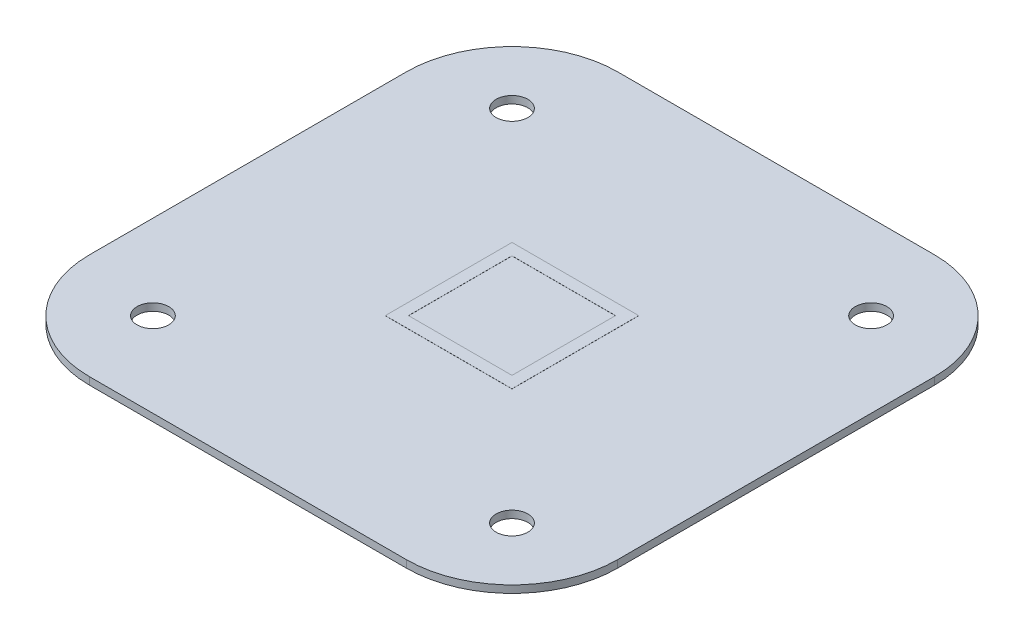
ISO-10303-21;
HEADER;
FILE_DESCRIPTION(('STEP AP214'),'2;1');
FILE_NAME('part.step','',(''),(''),'','','');
FILE_SCHEMA(('AUTOMOTIVE_DESIGN { 1 0 10303 214 1 1 1 1 }'));
ENDSEC;
DATA;
#1=APPLICATION_CONTEXT('core data for automotive mechanical design processes');
#2=APPLICATION_PROTOCOL_DEFINITION('international standard','automotive_design',2000,#1);
#3=PRODUCT_CONTEXT('',#1,'mechanical');
#4=PRODUCT('Part','Part','',(#3));
#5=PRODUCT_RELATED_PRODUCT_CATEGORY('part','',(#4));
#6=PRODUCT_DEFINITION_FORMATION('','',#4);
#7=PRODUCT_DEFINITION_CONTEXT('part definition',#1,'design');
#8=PRODUCT_DEFINITION('design','',#6,#7);
#9=PRODUCT_DEFINITION_SHAPE('','',#8);
#10=(LENGTH_UNIT() NAMED_UNIT(*) SI_UNIT(.MILLI.,.METRE.));
#11=(NAMED_UNIT(*) PLANE_ANGLE_UNIT() SI_UNIT($,.RADIAN.));
#12=(NAMED_UNIT(*) SI_UNIT($,.STERADIAN.) SOLID_ANGLE_UNIT());
#13=UNCERTAINTY_MEASURE_WITH_UNIT(LENGTH_MEASURE(1.E-05),#10,'distance_accuracy_value','');
#14=(GEOMETRIC_REPRESENTATION_CONTEXT(3) GLOBAL_UNCERTAINTY_ASSIGNED_CONTEXT((#13)) GLOBAL_UNIT_ASSIGNED_CONTEXT((#10,
#11,#12)) REPRESENTATION_CONTEXT('',''));
#15=CARTESIAN_POINT('',(0.,0.,0.));
#16=DIRECTION('',(0.,0.,1.));
#17=DIRECTION('',(1.,0.,0.));
#18=AXIS2_PLACEMENT_3D('',#15,#16,#17);
#19=CARTESIAN_POINT('',(0.,0.7,0.));
#20=DIRECTION('',(0.,1.,0.));
#21=DIRECTION('',(0.,0.,1.));
#22=AXIS2_PLACEMENT_3D('',#19,#20,#21);
#23=PLANE('',#22);
#24=CARTESIAN_POINT('',(-17.,0.7,17.));
#25=DIRECTION('',(0.,1.,0.));
#26=DIRECTION('',(0.,0.,1.));
#27=AXIS2_PLACEMENT_3D('',#24,#25,#26);
#28=CIRCLE('',#27,1.5);
#29=CARTESIAN_POINT('',(-17.,0.7,18.5));
#30=VERTEX_POINT('',#29);
#31=EDGE_CURVE('E213',#30,#30,#28,.T.);
#32=ORIENTED_EDGE('',*,*,#31,.F.);
#33=EDGE_LOOP('',(#32));
#34=FACE_BOUND('',#33,.T.);
#35=CARTESIAN_POINT('',(17.,0.7,-17.));
#36=DIRECTION('',(0.,1.,0.));
#37=DIRECTION('',(0.,0.,1.));
#38=AXIS2_PLACEMENT_3D('',#35,#36,#37);
#39=CIRCLE('',#38,1.5);
#40=CARTESIAN_POINT('',(17.,0.7,-15.5));
#41=VERTEX_POINT('',#40);
#42=EDGE_CURVE('E225',#41,#41,#39,.T.);
#43=ORIENTED_EDGE('',*,*,#42,.F.);
#44=EDGE_LOOP('',(#43));
#45=FACE_BOUND('',#44,.T.);
#46=DIRECTION('',(-1.,0.,0.));
#47=VECTOR('',#46,1.);
#48=CARTESIAN_POINT('',(25.,0.7,-25.));
#49=LINE('',#48,#47);
#50=CARTESIAN_POINT('',(15.,0.7,-25.));
#51=VERTEX_POINT('',#50);
#52=CARTESIAN_POINT('',(-15.,0.7,-25.));
#53=VERTEX_POINT('',#52);
#54=EDGE_CURVE('E247',#51,#53,#49,.T.);
#55=ORIENTED_EDGE('',*,*,#54,.T.);
#56=CARTESIAN_POINT('',(-15.,0.7,-15.));
#57=DIRECTION('',(0.,1.,0.));
#58=DIRECTION('',(0.,0.,1.));
#59=AXIS2_PLACEMENT_3D('',#56,#57,#58);
#60=CIRCLE('',#59,10.);
#61=CARTESIAN_POINT('',(-25.,0.7,-15.));
#62=VERTEX_POINT('',#61);
#63=EDGE_CURVE('E284',#53,#62,#60,.T.);
#64=ORIENTED_EDGE('',*,*,#63,.T.);
#65=DIRECTION('',(0.,0.,1.));
#66=VECTOR('',#65,1.);
#67=CARTESIAN_POINT('',(-25.,0.7,25.));
#68=LINE('',#67,#66);
#69=CARTESIAN_POINT('',(-25.,0.7,15.));
#70=VERTEX_POINT('',#69);
#71=EDGE_CURVE('E237',#62,#70,#68,.T.);
#72=ORIENTED_EDGE('',*,*,#71,.T.);
#73=CARTESIAN_POINT('',(-15.,0.7,15.));
#74=DIRECTION('',(0.,1.,0.));
#75=DIRECTION('',(0.,0.,1.));
#76=AXIS2_PLACEMENT_3D('',#73,#74,#75);
#77=CIRCLE('',#76,10.);
#78=CARTESIAN_POINT('',(-15.,0.7,25.));
#79=VERTEX_POINT('',#78);
#80=EDGE_CURVE('E278',#70,#79,#77,.T.);
#81=ORIENTED_EDGE('',*,*,#80,.T.);
#82=DIRECTION('',(1.,0.,0.));
#83=VECTOR('',#82,1.);
#84=CARTESIAN_POINT('',(25.,0.7,25.));
#85=LINE('',#84,#83);
#86=CARTESIAN_POINT('',(15.,0.7,25.));
#87=VERTEX_POINT('',#86);
#88=EDGE_CURVE('E240',#79,#87,#85,.T.);
#89=ORIENTED_EDGE('',*,*,#88,.T.);
#90=CARTESIAN_POINT('',(15.,0.7,15.));
#91=DIRECTION('',(0.,1.,0.));
#92=DIRECTION('',(0.,0.,1.));
#93=AXIS2_PLACEMENT_3D('',#90,#91,#92);
#94=CIRCLE('',#93,10.);
#95=CARTESIAN_POINT('',(25.,0.7,15.));
#96=VERTEX_POINT('',#95);
#97=EDGE_CURVE('E280',#87,#96,#94,.T.);
#98=ORIENTED_EDGE('',*,*,#97,.T.);
#99=DIRECTION('',(0.,0.,-1.));
#100=VECTOR('',#99,1.);
#101=CARTESIAN_POINT('',(25.,0.7,25.));
#102=LINE('',#101,#100);
#103=CARTESIAN_POINT('',(25.,0.7,-15.));
#104=VERTEX_POINT('',#103);
#105=EDGE_CURVE('E244',#96,#104,#102,.T.);
#106=ORIENTED_EDGE('',*,*,#105,.T.);
#107=CARTESIAN_POINT('',(15.,0.7,-15.));
#108=DIRECTION('',(0.,1.,0.));
#109=DIRECTION('',(0.,0.,1.));
#110=AXIS2_PLACEMENT_3D('',#107,#108,#109);
#111=CIRCLE('',#110,10.);
#112=EDGE_CURVE('E282',#104,#51,#111,.T.);
#113=ORIENTED_EDGE('',*,*,#112,.T.);
#114=EDGE_LOOP('',(#55,#64,#72,#81,#89,#98,#106,#113));
#115=FACE_BOUND('',#114,.T.);
#116=CARTESIAN_POINT('',(-17.,0.7,-17.));
#117=DIRECTION('',(0.,1.,0.));
#118=DIRECTION('',(0.,0.,1.));
#119=AXIS2_PLACEMENT_3D('',#116,#117,#118);
#120=CIRCLE('',#119,1.5);
#121=CARTESIAN_POINT('',(-17.,0.7,-15.5));
#122=VERTEX_POINT('',#121);
#123=EDGE_CURVE('E231',#122,#122,#120,.T.);
#124=ORIENTED_EDGE('',*,*,#123,.F.);
#125=EDGE_LOOP('',(#124));
#126=FACE_BOUND('',#125,.T.);
#127=CARTESIAN_POINT('',(17.,0.7,17.));
#128=DIRECTION('',(0.,1.,0.));
#129=DIRECTION('',(0.,0.,1.));
#130=AXIS2_PLACEMENT_3D('',#127,#128,#129);
#131=CIRCLE('',#130,1.5);
#132=CARTESIAN_POINT('',(17.,0.7,18.5));
#133=VERTEX_POINT('',#132);
#134=EDGE_CURVE('E219',#133,#133,#131,.T.);
#135=ORIENTED_EDGE('',*,*,#134,.F.);
#136=EDGE_LOOP('',(#135));
#137=FACE_BOUND('',#136,.T.);
#138=DIRECTION('',(1.,0.,0.));
#139=VECTOR('',#138,1.);
#140=CARTESIAN_POINT('',(6.,0.7,6.));
#141=LINE('',#140,#139);
#142=CARTESIAN_POINT('',(-6.,0.7,6.));
#143=VERTEX_POINT('',#142);
#144=CARTESIAN_POINT('',(6.,0.7,6.));
#145=VERTEX_POINT('',#144);
#146=EDGE_CURVE('E199',#143,#145,#141,.T.);
#147=ORIENTED_EDGE('',*,*,#146,.F.);
#148=DIRECTION('',(0.,0.,1.));
#149=VECTOR('',#148,1.);
#150=CARTESIAN_POINT('',(-6.,0.7,6.));
#151=LINE('',#150,#149);
#152=CARTESIAN_POINT('',(-6.,0.7,-6.));
#153=VERTEX_POINT('',#152);
#154=EDGE_CURVE('E164',#153,#143,#151,.T.);
#155=ORIENTED_EDGE('',*,*,#154,.F.);
#156=DIRECTION('',(-1.,0.,0.));
#157=VECTOR('',#156,1.);
#158=CARTESIAN_POINT('',(6.,0.7,-6.));
#159=LINE('',#158,#157);
#160=CARTESIAN_POINT('',(6.,0.7,-6.));
#161=VERTEX_POINT('',#160);
#162=EDGE_CURVE('E190',#161,#153,#159,.T.);
#163=ORIENTED_EDGE('',*,*,#162,.F.);
#164=DIRECTION('',(0.,0.,-1.));
#165=VECTOR('',#164,1.);
#166=CARTESIAN_POINT('',(6.,0.7,6.));
#167=LINE('',#166,#165);
#168=EDGE_CURVE('E201',#145,#161,#167,.T.);
#169=ORIENTED_EDGE('',*,*,#168,.F.);
#170=EDGE_LOOP('',(#147,#155,#163,#169));
#171=FACE_BOUND('',#170,.T.);
#172=ADVANCED_FACE('F33',(#34,#45,#115,#126,#137,#171),#23,.T.);
#173=CARTESIAN_POINT('',(0.,0.,0.));
#174=DIRECTION('',(0.,1.,0.));
#175=DIRECTION('',(0.,0.,1.));
#176=AXIS2_PLACEMENT_3D('',#173,#174,#175);
#177=PLANE('',#176);
#178=DIRECTION('',(0.,0.,1.));
#179=VECTOR('',#178,1.);
#180=CARTESIAN_POINT('',(-25.,0.,25.));
#181=LINE('',#180,#179);
#182=CARTESIAN_POINT('',(-25.,0.,-15.));
#183=VERTEX_POINT('',#182);
#184=CARTESIAN_POINT('',(-25.,0.,15.));
#185=VERTEX_POINT('',#184);
#186=EDGE_CURVE('E234',#183,#185,#181,.T.);
#187=ORIENTED_EDGE('',*,*,#186,.F.);
#188=CARTESIAN_POINT('',(-15.,0.,-15.));
#189=DIRECTION('',(0.,1.,0.));
#190=DIRECTION('',(0.,0.,1.));
#191=AXIS2_PLACEMENT_3D('',#188,#189,#190);
#192=CIRCLE('',#191,10.);
#193=CARTESIAN_POINT('',(-15.,0.,-25.));
#194=VERTEX_POINT('',#193);
#195=EDGE_CURVE('E271',#183,#194,#192,.F.);
#196=ORIENTED_EDGE('',*,*,#195,.T.);
#197=DIRECTION('',(-1.,0.,0.));
#198=VECTOR('',#197,1.);
#199=CARTESIAN_POINT('',(25.,0.,-25.));
#200=LINE('',#199,#198);
#201=CARTESIAN_POINT('',(15.,0.,-25.));
#202=VERTEX_POINT('',#201);
#203=EDGE_CURVE('E241',#202,#194,#200,.T.);
#204=ORIENTED_EDGE('',*,*,#203,.F.);
#205=CARTESIAN_POINT('',(15.,0.,-15.));
#206=DIRECTION('',(0.,1.,0.));
#207=DIRECTION('',(0.,0.,1.));
#208=AXIS2_PLACEMENT_3D('',#205,#206,#207);
#209=CIRCLE('',#208,10.);
#210=CARTESIAN_POINT('',(25.,0.,-15.));
#211=VERTEX_POINT('',#210);
#212=EDGE_CURVE('E269',#202,#211,#209,.F.);
#213=ORIENTED_EDGE('',*,*,#212,.T.);
#214=DIRECTION('',(0.,0.,-1.));
#215=VECTOR('',#214,1.);
#216=CARTESIAN_POINT('',(25.,0.,25.));
#217=LINE('',#216,#215);
#218=CARTESIAN_POINT('',(25.,0.,15.));
#219=VERTEX_POINT('',#218);
#220=EDGE_CURVE('E256',#219,#211,#217,.T.);
#221=ORIENTED_EDGE('',*,*,#220,.F.);
#222=CARTESIAN_POINT('',(15.,0.,15.));
#223=DIRECTION('',(0.,1.,0.));
#224=DIRECTION('',(0.,0.,1.));
#225=AXIS2_PLACEMENT_3D('',#222,#223,#224);
#226=CIRCLE('',#225,10.);
#227=CARTESIAN_POINT('',(15.,0.,25.));
#228=VERTEX_POINT('',#227);
#229=EDGE_CURVE('E267',#219,#228,#226,.F.);
#230=ORIENTED_EDGE('',*,*,#229,.T.);
#231=DIRECTION('',(1.,0.,0.));
#232=VECTOR('',#231,1.);
#233=CARTESIAN_POINT('',(25.,0.,25.));
#234=LINE('',#233,#232);
#235=CARTESIAN_POINT('',(-15.,0.,25.));
#236=VERTEX_POINT('',#235);
#237=EDGE_CURVE('E253',#236,#228,#234,.T.);
#238=ORIENTED_EDGE('',*,*,#237,.F.);
#239=CARTESIAN_POINT('',(-15.,0.,15.));
#240=DIRECTION('',(0.,1.,0.));
#241=DIRECTION('',(0.,0.,1.));
#242=AXIS2_PLACEMENT_3D('',#239,#240,#241);
#243=CIRCLE('',#242,10.);
#244=EDGE_CURVE('E265',#236,#185,#243,.F.);
#245=ORIENTED_EDGE('',*,*,#244,.T.);
#246=EDGE_LOOP('',(#187,#196,#204,#213,#221,#230,#238,#245));
#247=FACE_BOUND('',#246,.T.);
#248=CARTESIAN_POINT('',(-17.,0.,-17.));
#249=DIRECTION('',(0.,1.,0.));
#250=DIRECTION('',(0.,0.,1.));
#251=AXIS2_PLACEMENT_3D('',#248,#249,#250);
#252=CIRCLE('',#251,1.5);
#253=CARTESIAN_POINT('',(-17.,0.,-15.5));
#254=VERTEX_POINT('',#253);
#255=EDGE_CURVE('E228',#254,#254,#252,.T.);
#256=ORIENTED_EDGE('',*,*,#255,.T.);
#257=EDGE_LOOP('',(#256));
#258=FACE_BOUND('',#257,.T.);
#259=CARTESIAN_POINT('',(17.,0.,-17.));
#260=DIRECTION('',(0.,1.,0.));
#261=DIRECTION('',(0.,0.,1.));
#262=AXIS2_PLACEMENT_3D('',#259,#260,#261);
#263=CIRCLE('',#262,1.5);
#264=CARTESIAN_POINT('',(17.,0.,-15.5));
#265=VERTEX_POINT('',#264);
#266=EDGE_CURVE('E222',#265,#265,#263,.T.);
#267=ORIENTED_EDGE('',*,*,#266,.T.);
#268=EDGE_LOOP('',(#267));
#269=FACE_BOUND('',#268,.T.);
#270=CARTESIAN_POINT('',(17.,0.,17.));
#271=DIRECTION('',(0.,1.,0.));
#272=DIRECTION('',(0.,0.,1.));
#273=AXIS2_PLACEMENT_3D('',#270,#271,#272);
#274=CIRCLE('',#273,1.5);
#275=CARTESIAN_POINT('',(17.,0.,18.5));
#276=VERTEX_POINT('',#275);
#277=EDGE_CURVE('E216',#276,#276,#274,.T.);
#278=ORIENTED_EDGE('',*,*,#277,.T.);
#279=EDGE_LOOP('',(#278));
#280=FACE_BOUND('',#279,.T.);
#281=CARTESIAN_POINT('',(-17.,0.,17.));
#282=DIRECTION('',(0.,1.,0.));
#283=DIRECTION('',(0.,0.,1.));
#284=AXIS2_PLACEMENT_3D('',#281,#282,#283);
#285=CIRCLE('',#284,1.5);
#286=CARTESIAN_POINT('',(-17.,0.,18.5));
#287=VERTEX_POINT('',#286);
#288=EDGE_CURVE('E212',#287,#287,#285,.T.);
#289=ORIENTED_EDGE('',*,*,#288,.T.);
#290=EDGE_LOOP('',(#289));
#291=FACE_BOUND('',#290,.T.);
#292=ADVANCED_FACE('F301',(#247,#258,#269,#280,#291),#177,.F.);
#293=CARTESIAN_POINT('',(-25.,0.7,25.));
#294=DIRECTION('',(1.,0.,0.));
#295=DIRECTION('',(0.,0.,-1.));
#296=AXIS2_PLACEMENT_3D('',#293,#294,#295);
#297=PLANE('',#296);
#298=ORIENTED_EDGE('',*,*,#71,.F.);
#299=DIRECTION('',(0.,-1.,0.));
#300=VECTOR('',#299,1.);
#301=CARTESIAN_POINT('',(-25.,0.7,-15.));
#302=LINE('',#301,#300);
#303=EDGE_CURVE('E262',#62,#183,#302,.T.);
#304=ORIENTED_EDGE('',*,*,#303,.T.);
#305=ORIENTED_EDGE('',*,*,#186,.T.);
#306=DIRECTION('',(0.,-1.,0.));
#307=VECTOR('',#306,1.);
#308=CARTESIAN_POINT('',(-25.,0.7,15.));
#309=LINE('',#308,#307);
#310=EDGE_CURVE('E250',#185,#70,#309,.F.);
#311=ORIENTED_EDGE('',*,*,#310,.T.);
#312=EDGE_LOOP('',(#298,#304,#305,#311));
#313=FACE_BOUND('',#312,.T.);
#314=ADVANCED_FACE('F329',(#313),#297,.F.);
#315=CARTESIAN_POINT('',(25.,0.7,25.));
#316=DIRECTION('',(0.,0.,-1.));
#317=DIRECTION('',(-1.,0.,0.));
#318=AXIS2_PLACEMENT_3D('',#315,#316,#317);
#319=PLANE('',#318);
#320=ORIENTED_EDGE('',*,*,#237,.T.);
#321=DIRECTION('',(0.,-1.,0.));
#322=VECTOR('',#321,1.);
#323=CARTESIAN_POINT('',(15.,0.7,25.));
#324=LINE('',#323,#322);
#325=EDGE_CURVE('E11',#228,#87,#324,.F.);
#326=ORIENTED_EDGE('',*,*,#325,.T.);
#327=ORIENTED_EDGE('',*,*,#88,.F.);
#328=DIRECTION('',(0.,-1.,0.));
#329=VECTOR('',#328,1.);
#330=CARTESIAN_POINT('',(-15.,0.7,25.));
#331=LINE('',#330,#329);
#332=EDGE_CURVE('E41',#79,#236,#331,.T.);
#333=ORIENTED_EDGE('',*,*,#332,.T.);
#334=EDGE_LOOP('',(#320,#326,#327,#333));
#335=FACE_BOUND('',#334,.T.);
#336=ADVANCED_FACE('F295',(#335),#319,.F.);
#337=CARTESIAN_POINT('',(25.,0.7,25.));
#338=DIRECTION('',(-1.,0.,0.));
#339=DIRECTION('',(0.,0.,1.));
#340=AXIS2_PLACEMENT_3D('',#337,#338,#339);
#341=PLANE('',#340);
#342=ORIENTED_EDGE('',*,*,#220,.T.);
#343=DIRECTION('',(0.,-1.,0.));
#344=VECTOR('',#343,1.);
#345=CARTESIAN_POINT('',(25.,0.7,-15.));
#346=LINE('',#345,#344);
#347=EDGE_CURVE('E289',#211,#104,#346,.F.);
#348=ORIENTED_EDGE('',*,*,#347,.T.);
#349=ORIENTED_EDGE('',*,*,#105,.F.);
#350=DIRECTION('',(0.,-1.,0.));
#351=VECTOR('',#350,1.);
#352=CARTESIAN_POINT('',(25.,0.7,15.));
#353=LINE('',#352,#351);
#354=EDGE_CURVE('E286',#96,#219,#353,.T.);
#355=ORIENTED_EDGE('',*,*,#354,.T.);
#356=EDGE_LOOP('',(#342,#348,#349,#355));
#357=FACE_BOUND('',#356,.T.);
#358=ADVANCED_FACE('F310',(#357),#341,.F.);
#359=CARTESIAN_POINT('',(25.,0.7,-25.));
#360=DIRECTION('',(0.,0.,1.));
#361=DIRECTION('',(1.,0.,0.));
#362=AXIS2_PLACEMENT_3D('',#359,#360,#361);
#363=PLANE('',#362);
#364=ORIENTED_EDGE('',*,*,#203,.T.);
#365=DIRECTION('',(0.,-1.,0.));
#366=VECTOR('',#365,1.);
#367=CARTESIAN_POINT('',(-15.,0.7,-25.));
#368=LINE('',#367,#366);
#369=EDGE_CURVE('E276',#194,#53,#368,.F.);
#370=ORIENTED_EDGE('',*,*,#369,.T.);
#371=ORIENTED_EDGE('',*,*,#54,.F.);
#372=DIRECTION('',(0.,-1.,0.));
#373=VECTOR('',#372,1.);
#374=CARTESIAN_POINT('',(15.,0.7,-25.));
#375=LINE('',#374,#373);
#376=EDGE_CURVE('E273',#51,#202,#375,.T.);
#377=ORIENTED_EDGE('',*,*,#376,.T.);
#378=EDGE_LOOP('',(#364,#370,#371,#377));
#379=FACE_BOUND('',#378,.T.);
#380=ADVANCED_FACE('F321',(#379),#363,.F.);
#381=CARTESIAN_POINT('',(-17.,0.7,-17.));
#382=DIRECTION('',(0.,-1.,0.));
#383=DIRECTION('',(0.,0.,-1.));
#384=AXIS2_PLACEMENT_3D('',#381,#382,#383);
#385=CYLINDRICAL_SURFACE('',#384,1.5);
#386=ORIENTED_EDGE('',*,*,#123,.T.);
#387=EDGE_LOOP('',(#386));
#388=FACE_BOUND('',#387,.T.);
#389=ORIENTED_EDGE('',*,*,#255,.F.);
#390=EDGE_LOOP('',(#389));
#391=FACE_BOUND('',#390,.T.);
#392=ADVANCED_FACE('F393',(#388,#391),#385,.F.);
#393=CARTESIAN_POINT('',(17.,0.7,-17.));
#394=DIRECTION('',(0.,-1.,0.));
#395=DIRECTION('',(0.,0.,-1.));
#396=AXIS2_PLACEMENT_3D('',#393,#394,#395);
#397=CYLINDRICAL_SURFACE('',#396,1.5);
#398=ORIENTED_EDGE('',*,*,#42,.T.);
#399=EDGE_LOOP('',(#398));
#400=FACE_BOUND('',#399,.T.);
#401=ORIENTED_EDGE('',*,*,#266,.F.);
#402=EDGE_LOOP('',(#401));
#403=FACE_BOUND('',#402,.T.);
#404=ADVANCED_FACE('F390',(#400,#403),#397,.F.);
#405=CARTESIAN_POINT('',(17.,0.7,17.));
#406=DIRECTION('',(0.,-1.,0.));
#407=DIRECTION('',(0.,0.,-1.));
#408=AXIS2_PLACEMENT_3D('',#405,#406,#407);
#409=CYLINDRICAL_SURFACE('',#408,1.5);
#410=ORIENTED_EDGE('',*,*,#134,.T.);
#411=EDGE_LOOP('',(#410));
#412=FACE_BOUND('',#411,.T.);
#413=ORIENTED_EDGE('',*,*,#277,.F.);
#414=EDGE_LOOP('',(#413));
#415=FACE_BOUND('',#414,.T.);
#416=ADVANCED_FACE('F386',(#412,#415),#409,.F.);
#417=CARTESIAN_POINT('',(-17.,0.7,17.));
#418=DIRECTION('',(0.,-1.,0.));
#419=DIRECTION('',(0.,0.,-1.));
#420=AXIS2_PLACEMENT_3D('',#417,#418,#419);
#421=CYLINDRICAL_SURFACE('',#420,1.5);
#422=ORIENTED_EDGE('',*,*,#31,.T.);
#423=EDGE_LOOP('',(#422));
#424=FACE_BOUND('',#423,.T.);
#425=ORIENTED_EDGE('',*,*,#288,.F.);
#426=EDGE_LOOP('',(#425));
#427=FACE_BOUND('',#426,.T.);
#428=ADVANCED_FACE('F383',(#424,#427),#421,.F.);
#429=CARTESIAN_POINT('',(-15.,0.7,-15.));
#430=DIRECTION('',(0.,-1.,0.));
#431=DIRECTION('',(0.,0.,-1.));
#432=AXIS2_PLACEMENT_3D('',#429,#430,#431);
#433=CYLINDRICAL_SURFACE('',#432,10.);
#434=ORIENTED_EDGE('',*,*,#63,.F.);
#435=ORIENTED_EDGE('',*,*,#369,.F.);
#436=ORIENTED_EDGE('',*,*,#195,.F.);
#437=ORIENTED_EDGE('',*,*,#303,.F.);
#438=EDGE_LOOP('',(#434,#435,#436,#437));
#439=FACE_BOUND('',#438,.T.);
#440=ADVANCED_FACE('F326',(#439),#433,.T.);
#441=CARTESIAN_POINT('',(15.,0.7,-15.));
#442=DIRECTION('',(0.,-1.,0.));
#443=DIRECTION('',(0.,0.,-1.));
#444=AXIS2_PLACEMENT_3D('',#441,#442,#443);
#445=CYLINDRICAL_SURFACE('',#444,10.);
#446=ORIENTED_EDGE('',*,*,#112,.F.);
#447=ORIENTED_EDGE('',*,*,#347,.F.);
#448=ORIENTED_EDGE('',*,*,#212,.F.);
#449=ORIENTED_EDGE('',*,*,#376,.F.);
#450=EDGE_LOOP('',(#446,#447,#448,#449));
#451=FACE_BOUND('',#450,.T.);
#452=ADVANCED_FACE('F318',(#451),#445,.T.);
#453=CARTESIAN_POINT('',(15.,0.7,15.));
#454=DIRECTION('',(0.,-1.,0.));
#455=DIRECTION('',(0.,0.,-1.));
#456=AXIS2_PLACEMENT_3D('',#453,#454,#455);
#457=CYLINDRICAL_SURFACE('',#456,10.);
#458=ORIENTED_EDGE('',*,*,#97,.F.);
#459=ORIENTED_EDGE('',*,*,#325,.F.);
#460=ORIENTED_EDGE('',*,*,#229,.F.);
#461=ORIENTED_EDGE('',*,*,#354,.F.);
#462=EDGE_LOOP('',(#458,#459,#460,#461));
#463=FACE_BOUND('',#462,.T.);
#464=ADVANCED_FACE('F307',(#463),#457,.T.);
#465=CARTESIAN_POINT('',(-15.,0.7,15.));
#466=DIRECTION('',(0.,-1.,0.));
#467=DIRECTION('',(0.,0.,-1.));
#468=AXIS2_PLACEMENT_3D('',#465,#466,#467);
#469=CYLINDRICAL_SURFACE('',#468,10.);
#470=ORIENTED_EDGE('',*,*,#80,.F.);
#471=ORIENTED_EDGE('',*,*,#310,.F.);
#472=ORIENTED_EDGE('',*,*,#244,.F.);
#473=ORIENTED_EDGE('',*,*,#332,.F.);
#474=EDGE_LOOP('',(#470,#471,#472,#473));
#475=FACE_BOUND('',#474,.T.);
#476=ADVANCED_FACE('F35',(#475),#469,.T.);
#477=CARTESIAN_POINT('',(0.,0.71,0.));
#478=DIRECTION('',(0.,1.,0.));
#479=DIRECTION('',(0.,0.,1.));
#480=AXIS2_PLACEMENT_3D('',#477,#478,#479);
#481=PLANE('',#480);
#482=DIRECTION('',(0.,0.,1.));
#483=VECTOR('',#482,1.);
#484=CARTESIAN_POINT('',(-6.,0.71,6.));
#485=LINE('',#484,#483);
#486=CARTESIAN_POINT('',(-6.,0.71,-6.));
#487=VERTEX_POINT('',#486);
#488=CARTESIAN_POINT('',(-6.,0.71,6.));
#489=VERTEX_POINT('',#488);
#490=EDGE_CURVE('E186',#487,#489,#485,.T.);
#491=ORIENTED_EDGE('',*,*,#490,.T.);
#492=DIRECTION('',(1.,0.,0.));
#493=VECTOR('',#492,1.);
#494=CARTESIAN_POINT('',(6.,0.71,6.));
#495=LINE('',#494,#493);
#496=CARTESIAN_POINT('',(6.,0.71,6.));
#497=VERTEX_POINT('',#496);
#498=EDGE_CURVE('E189',#489,#497,#495,.T.);
#499=ORIENTED_EDGE('',*,*,#498,.T.);
#500=DIRECTION('',(0.,0.,-1.));
#501=VECTOR('',#500,1.);
#502=CARTESIAN_POINT('',(6.,0.71,6.));
#503=LINE('',#502,#501);
#504=CARTESIAN_POINT('',(6.,0.71,-6.));
#505=VERTEX_POINT('',#504);
#506=EDGE_CURVE('E192',#497,#505,#503,.T.);
#507=ORIENTED_EDGE('',*,*,#506,.T.);
#508=DIRECTION('',(-1.,0.,0.));
#509=VECTOR('',#508,1.);
#510=CARTESIAN_POINT('',(6.,0.71,-6.));
#511=LINE('',#510,#509);
#512=EDGE_CURVE('E194',#505,#487,#511,.T.);
#513=ORIENTED_EDGE('',*,*,#512,.T.);
#514=EDGE_LOOP('',(#491,#499,#507,#513));
#515=FACE_BOUND('',#514,.T.);
#516=DIRECTION('',(1.,0.,0.));
#517=VECTOR('',#516,1.);
#518=CARTESIAN_POINT('',(4.9,0.71,4.9));
#519=LINE('',#518,#517);
#520=CARTESIAN_POINT('',(-4.9,0.71,4.9));
#521=VERTEX_POINT('',#520);
#522=CARTESIAN_POINT('',(4.9,0.71,4.9));
#523=VERTEX_POINT('',#522);
#524=EDGE_CURVE('E156',#521,#523,#519,.T.);
#525=ORIENTED_EDGE('',*,*,#524,.F.);
#526=DIRECTION('',(0.,0.,1.));
#527=VECTOR('',#526,1.);
#528=CARTESIAN_POINT('',(-4.9,0.71,4.9));
#529=LINE('',#528,#527);
#530=CARTESIAN_POINT('',(-4.9,0.71,-4.9));
#531=VERTEX_POINT('',#530);
#532=EDGE_CURVE('E147',#531,#521,#529,.T.);
#533=ORIENTED_EDGE('',*,*,#532,.F.);
#534=DIRECTION('',(-1.,0.,0.));
#535=VECTOR('',#534,1.);
#536=CARTESIAN_POINT('',(4.9,0.71,-4.9));
#537=LINE('',#536,#535);
#538=CARTESIAN_POINT('',(4.9,0.71,-4.9));
#539=VERTEX_POINT('',#538);
#540=EDGE_CURVE('E172',#539,#531,#537,.T.);
#541=ORIENTED_EDGE('',*,*,#540,.F.);
#542=DIRECTION('',(0.,0.,-1.));
#543=VECTOR('',#542,1.);
#544=CARTESIAN_POINT('',(4.9,0.71,4.9));
#545=LINE('',#544,#543);
#546=EDGE_CURVE('E170',#523,#539,#545,.T.);
#547=ORIENTED_EDGE('',*,*,#546,.F.);
#548=EDGE_LOOP('',(#525,#533,#541,#547));
#549=FACE_BOUND('',#548,.T.);
#550=ADVANCED_FACE('F168',(#515,#549),#481,.T.);
#551=CARTESIAN_POINT('',(-6.,0.71,6.));
#552=DIRECTION('',(1.,0.,0.));
#553=DIRECTION('',(0.,0.,-1.));
#554=AXIS2_PLACEMENT_3D('',#551,#552,#553);
#555=PLANE('',#554);
#556=ORIENTED_EDGE('',*,*,#154,.T.);
#557=DIRECTION('',(0.,-1.,0.));
#558=VECTOR('',#557,1.);
#559=CARTESIAN_POINT('',(-6.,0.71,6.));
#560=LINE('',#559,#558);
#561=EDGE_CURVE('E210',#489,#143,#560,.T.);
#562=ORIENTED_EDGE('',*,*,#561,.F.);
#563=ORIENTED_EDGE('',*,*,#490,.F.);
#564=DIRECTION('',(0.,-1.,0.));
#565=VECTOR('',#564,1.);
#566=CARTESIAN_POINT('',(-6.,0.71,-6.));
#567=LINE('',#566,#565);
#568=EDGE_CURVE('E196',#487,#153,#567,.T.);
#569=ORIENTED_EDGE('',*,*,#568,.T.);
#570=EDGE_LOOP('',(#556,#562,#563,#569));
#571=FACE_BOUND('',#570,.T.);
#572=ADVANCED_FACE('F336',(#571),#555,.F.);
#573=CARTESIAN_POINT('',(6.,0.71,6.));
#574=DIRECTION('',(0.,0.,-1.));
#575=DIRECTION('',(-1.,0.,0.));
#576=AXIS2_PLACEMENT_3D('',#573,#574,#575);
#577=PLANE('',#576);
#578=ORIENTED_EDGE('',*,*,#146,.T.);
#579=DIRECTION('',(0.,-1.,0.));
#580=VECTOR('',#579,1.);
#581=CARTESIAN_POINT('',(6.,0.71,6.));
#582=LINE('',#581,#580);
#583=EDGE_CURVE('E207',#497,#145,#582,.T.);
#584=ORIENTED_EDGE('',*,*,#583,.F.);
#585=ORIENTED_EDGE('',*,*,#498,.F.);
#586=ORIENTED_EDGE('',*,*,#561,.T.);
#587=EDGE_LOOP('',(#578,#584,#585,#586));
#588=FACE_BOUND('',#587,.T.);
#589=ADVANCED_FACE('F375',(#588),#577,.F.);
#590=CARTESIAN_POINT('',(6.,0.71,6.));
#591=DIRECTION('',(-1.,0.,0.));
#592=DIRECTION('',(0.,0.,1.));
#593=AXIS2_PLACEMENT_3D('',#590,#591,#592);
#594=PLANE('',#593);
#595=ORIENTED_EDGE('',*,*,#168,.T.);
#596=DIRECTION('',(0.,-1.,0.));
#597=VECTOR('',#596,1.);
#598=CARTESIAN_POINT('',(6.,0.71,-6.));
#599=LINE('',#598,#597);
#600=EDGE_CURVE('E48',#505,#161,#599,.T.);
#601=ORIENTED_EDGE('',*,*,#600,.F.);
#602=ORIENTED_EDGE('',*,*,#506,.F.);
#603=ORIENTED_EDGE('',*,*,#583,.T.);
#604=EDGE_LOOP('',(#595,#601,#602,#603));
#605=FACE_BOUND('',#604,.T.);
#606=ADVANCED_FACE('F372',(#605),#594,.F.);
#607=CARTESIAN_POINT('',(6.,0.71,-6.));
#608=DIRECTION('',(0.,0.,1.));
#609=DIRECTION('',(1.,0.,0.));
#610=AXIS2_PLACEMENT_3D('',#607,#608,#609);
#611=PLANE('',#610);
#612=ORIENTED_EDGE('',*,*,#162,.T.);
#613=ORIENTED_EDGE('',*,*,#568,.F.);
#614=ORIENTED_EDGE('',*,*,#512,.F.);
#615=ORIENTED_EDGE('',*,*,#600,.T.);
#616=EDGE_LOOP('',(#612,#613,#614,#615));
#617=FACE_BOUND('',#616,.T.);
#618=ADVANCED_FACE('F368',(#617),#611,.F.);
#619=CARTESIAN_POINT('',(-4.9,0.71,4.9));
#620=DIRECTION('',(1.,0.,0.));
#621=DIRECTION('',(0.,0.,-1.));
#622=AXIS2_PLACEMENT_3D('',#619,#620,#621);
#623=PLANE('',#622);
#624=DIRECTION('',(0.,0.,1.));
#625=VECTOR('',#624,1.);
#626=CARTESIAN_POINT('',(-4.9,0.7,4.9));
#627=LINE('',#626,#625);
#628=CARTESIAN_POINT('',(-4.9,0.7,-4.9));
#629=VERTEX_POINT('',#628);
#630=CARTESIAN_POINT('',(-4.9,0.7,4.9));
#631=VERTEX_POINT('',#630);
#632=EDGE_CURVE('E56',#629,#631,#627,.T.);
#633=ORIENTED_EDGE('',*,*,#632,.F.);
#634=DIRECTION('',(0.,-1.,0.));
#635=VECTOR('',#634,1.);
#636=CARTESIAN_POINT('',(-4.9,0.71,-4.9));
#637=LINE('',#636,#635);
#638=EDGE_CURVE('E152',#531,#629,#637,.T.);
#639=ORIENTED_EDGE('',*,*,#638,.F.);
#640=ORIENTED_EDGE('',*,*,#532,.T.);
#641=DIRECTION('',(0.,-1.,0.));
#642=VECTOR('',#641,1.);
#643=CARTESIAN_POINT('',(-4.9,0.71,4.9));
#644=LINE('',#643,#642);
#645=EDGE_CURVE('E150',#521,#631,#644,.T.);
#646=ORIENTED_EDGE('',*,*,#645,.T.);
#647=EDGE_LOOP('',(#633,#639,#640,#646));
#648=FACE_BOUND('',#647,.T.);
#649=ADVANCED_FACE('F149',(#648),#623,.T.);
#650=CARTESIAN_POINT('',(4.9,0.71,4.9));
#651=DIRECTION('',(0.,0.,-1.));
#652=DIRECTION('',(-1.,0.,0.));
#653=AXIS2_PLACEMENT_3D('',#650,#651,#652);
#654=PLANE('',#653);
#655=DIRECTION('',(1.,0.,0.));
#656=VECTOR('',#655,1.);
#657=CARTESIAN_POINT('',(4.9,0.7,4.9));
#658=LINE('',#657,#656);
#659=CARTESIAN_POINT('',(4.9,0.7,4.9));
#660=VERTEX_POINT('',#659);
#661=EDGE_CURVE('E163',#631,#660,#658,.T.);
#662=ORIENTED_EDGE('',*,*,#661,.F.);
#663=ORIENTED_EDGE('',*,*,#645,.F.);
#664=ORIENTED_EDGE('',*,*,#524,.T.);
#665=DIRECTION('',(0.,-1.,0.));
#666=VECTOR('',#665,1.);
#667=CARTESIAN_POINT('',(4.9,0.71,4.9));
#668=LINE('',#667,#666);
#669=EDGE_CURVE('E165',#523,#660,#668,.T.);
#670=ORIENTED_EDGE('',*,*,#669,.T.);
#671=EDGE_LOOP('',(#662,#663,#664,#670));
#672=FACE_BOUND('',#671,.T.);
#673=ADVANCED_FACE('F160',(#672),#654,.T.);
#674=CARTESIAN_POINT('',(4.9,0.71,4.9));
#675=DIRECTION('',(-1.,0.,0.));
#676=DIRECTION('',(0.,0.,1.));
#677=AXIS2_PLACEMENT_3D('',#674,#675,#676);
#678=PLANE('',#677);
#679=DIRECTION('',(0.,0.,-1.));
#680=VECTOR('',#679,1.);
#681=CARTESIAN_POINT('',(4.9,0.7,4.9));
#682=LINE('',#681,#680);
#683=CARTESIAN_POINT('',(4.9,0.7,-4.9));
#684=VERTEX_POINT('',#683);
#685=EDGE_CURVE('E178',#660,#684,#682,.T.);
#686=ORIENTED_EDGE('',*,*,#685,.F.);
#687=ORIENTED_EDGE('',*,*,#669,.F.);
#688=ORIENTED_EDGE('',*,*,#546,.T.);
#689=DIRECTION('',(0.,-1.,0.));
#690=VECTOR('',#689,1.);
#691=CARTESIAN_POINT('',(4.9,0.71,-4.9));
#692=LINE('',#691,#690);
#693=EDGE_CURVE('E182',#539,#684,#692,.T.);
#694=ORIENTED_EDGE('',*,*,#693,.T.);
#695=EDGE_LOOP('',(#686,#687,#688,#694));
#696=FACE_BOUND('',#695,.T.);
#697=ADVANCED_FACE('F355',(#696),#678,.T.);
#698=CARTESIAN_POINT('',(4.9,0.71,-4.9));
#699=DIRECTION('',(0.,0.,1.));
#700=DIRECTION('',(1.,0.,0.));
#701=AXIS2_PLACEMENT_3D('',#698,#699,#700);
#702=PLANE('',#701);
#703=DIRECTION('',(-1.,0.,0.));
#704=VECTOR('',#703,1.);
#705=CARTESIAN_POINT('',(4.9,0.7,-4.9));
#706=LINE('',#705,#704);
#707=EDGE_CURVE('E157',#684,#629,#706,.T.);
#708=ORIENTED_EDGE('',*,*,#707,.F.);
#709=ORIENTED_EDGE('',*,*,#693,.F.);
#710=ORIENTED_EDGE('',*,*,#540,.T.);
#711=ORIENTED_EDGE('',*,*,#638,.T.);
#712=EDGE_LOOP('',(#708,#709,#710,#711));
#713=FACE_BOUND('',#712,.T.);
#714=ADVANCED_FACE('F351',(#713),#702,.T.);
#715=ORIENTED_EDGE('',*,*,#632,.T.);
#716=ORIENTED_EDGE('',*,*,#661,.T.);
#717=ORIENTED_EDGE('',*,*,#685,.T.);
#718=ORIENTED_EDGE('',*,*,#707,.T.);
#719=EDGE_LOOP('',(#715,#716,#717,#718));
#720=FACE_BOUND('',#719,.T.);
#721=ADVANCED_FACE('F342',(#720),#23,.T.);
#722=CLOSED_SHELL('',(#172,#292,#314,#336,#358,#380,#392,#404,#416,#428,#440,#452,#464,#476,
#550,#572,#589,#606,#618,#649,#673,#697,#714,#721));
#723=MANIFOLD_SOLID_BREP('B2',#722);
#724=ADVANCED_BREP_SHAPE_REPRESENTATION('',(#18,#723),#14);
#725=SHAPE_DEFINITION_REPRESENTATION(#9,#724);
ENDSEC;
END-ISO-10303-21;
